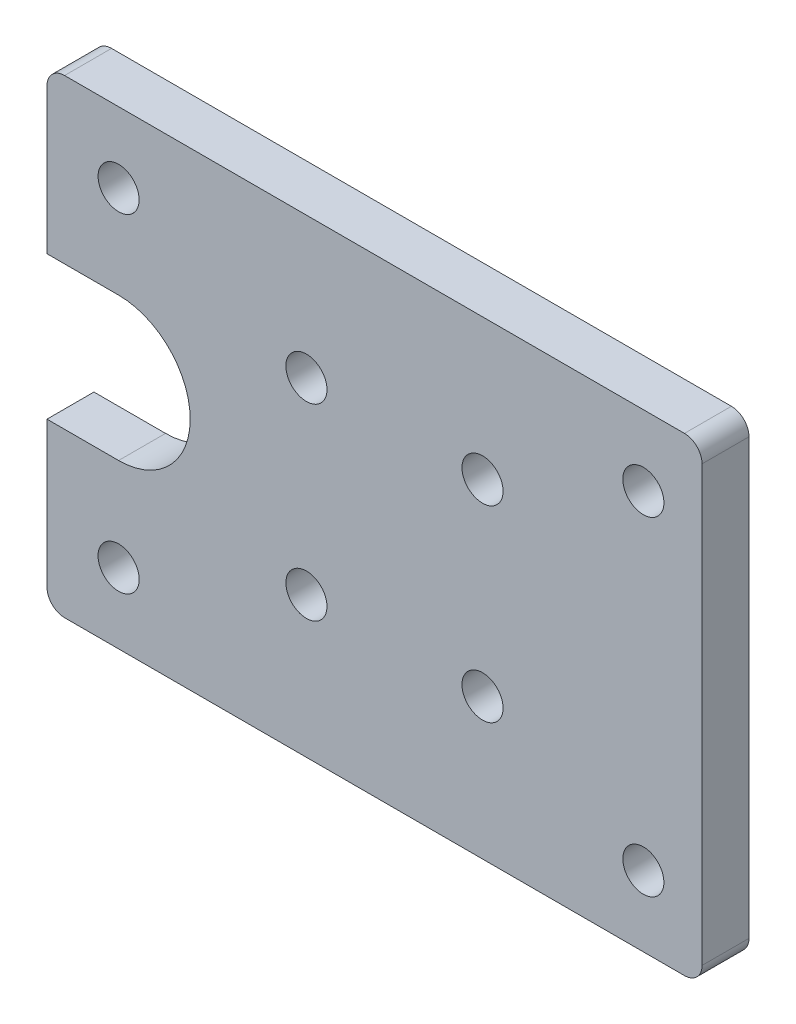
ISO-10303-21;
HEADER;
FILE_DESCRIPTION(('STEP AP214'),'2;1');
FILE_NAME('part.step','',(''),(''),'','','');
FILE_SCHEMA(('AUTOMOTIVE_DESIGN { 1 0 10303 214 1 1 1 1 }'));
ENDSEC;
DATA;
#1=APPLICATION_CONTEXT('core data for automotive mechanical design processes');
#2=APPLICATION_PROTOCOL_DEFINITION('international standard','automotive_design',2000,#1);
#3=PRODUCT_CONTEXT('',#1,'mechanical');
#4=PRODUCT('Part','Part','',(#3));
#5=PRODUCT_RELATED_PRODUCT_CATEGORY('part','',(#4));
#6=PRODUCT_DEFINITION_FORMATION('','',#4);
#7=PRODUCT_DEFINITION_CONTEXT('part definition',#1,'design');
#8=PRODUCT_DEFINITION('design','',#6,#7);
#9=PRODUCT_DEFINITION_SHAPE('','',#8);
#10=(LENGTH_UNIT() NAMED_UNIT(*) SI_UNIT(.MILLI.,.METRE.));
#11=(NAMED_UNIT(*) PLANE_ANGLE_UNIT() SI_UNIT($,.RADIAN.));
#12=(NAMED_UNIT(*) SI_UNIT($,.STERADIAN.) SOLID_ANGLE_UNIT());
#13=UNCERTAINTY_MEASURE_WITH_UNIT(LENGTH_MEASURE(1.E-05),#10,'distance_accuracy_value','');
#14=(GEOMETRIC_REPRESENTATION_CONTEXT(3) GLOBAL_UNCERTAINTY_ASSIGNED_CONTEXT((#13)) GLOBAL_UNIT_ASSIGNED_CONTEXT((#10,
#11,#12)) REPRESENTATION_CONTEXT('',''));
#15=CARTESIAN_POINT('',(0.,0.,0.));
#16=DIRECTION('',(0.,0.,1.));
#17=DIRECTION('',(1.,0.,0.));
#18=AXIS2_PLACEMENT_3D('',#15,#16,#17);
#19=CARTESIAN_POINT('',(31.5,-20.,4.));
#20=DIRECTION('',(0.,1.,0.));
#21=DIRECTION('',(-1.,0.,0.));
#22=AXIS2_PLACEMENT_3D('',#19,#20,#21);
#23=PLANE('',#22);
#24=DIRECTION('',(1.,0.,0.));
#25=VECTOR('',#24,1.);
#26=CARTESIAN_POINT('',(31.5,-20.,0.));
#27=LINE('',#26,#25);
#28=CARTESIAN_POINT('',(-26.3,-20.,0.));
#29=VERTEX_POINT('',#28);
#30=CARTESIAN_POINT('',(26.5,-20.,0.));
#31=VERTEX_POINT('',#30);
#32=EDGE_CURVE('E216',#29,#31,#27,.T.);
#33=ORIENTED_EDGE('',*,*,#32,.T.);
#34=DIRECTION('',(0.,0.,-1.));
#35=VECTOR('',#34,1.);
#36=CARTESIAN_POINT('',(26.5,-20.,4.));
#37=LINE('',#36,#35);
#38=CARTESIAN_POINT('',(26.5,-20.,4.));
#39=VERTEX_POINT('',#38);
#40=EDGE_CURVE('E256',#31,#39,#37,.F.);
#41=ORIENTED_EDGE('',*,*,#40,.T.);
#42=DIRECTION('',(1.,0.,0.));
#43=VECTOR('',#42,1.);
#44=CARTESIAN_POINT('',(31.5,-20.,4.));
#45=LINE('',#44,#43);
#46=CARTESIAN_POINT('',(-26.3,-20.,4.));
#47=VERTEX_POINT('',#46);
#48=EDGE_CURVE('E218',#47,#39,#45,.T.);
#49=ORIENTED_EDGE('',*,*,#48,.F.);
#50=DIRECTION('',(0.,0.,-1.));
#51=VECTOR('',#50,1.);
#52=CARTESIAN_POINT('',(-26.3,-20.,4.));
#53=LINE('',#52,#51);
#54=EDGE_CURVE('E253',#47,#29,#53,.T.);
#55=ORIENTED_EDGE('',*,*,#54,.T.);
#56=EDGE_LOOP('',(#33,#41,#49,#55));
#57=FACE_BOUND('',#56,.T.);
#58=ADVANCED_FACE('F34',(#57),#23,.F.);
#59=CARTESIAN_POINT('',(31.5,20.,4.));
#60=DIRECTION('',(0.,-1.,0.));
#61=DIRECTION('',(1.,0.,0.));
#62=AXIS2_PLACEMENT_3D('',#59,#60,#61);
#63=PLANE('',#62);
#64=DIRECTION('',(-1.,0.,0.));
#65=VECTOR('',#64,1.);
#66=CARTESIAN_POINT('',(31.5,20.,4.));
#67=LINE('',#66,#65);
#68=CARTESIAN_POINT('',(26.5,20.,4.));
#69=VERTEX_POINT('',#68);
#70=CARTESIAN_POINT('',(-26.3,20.,4.));
#71=VERTEX_POINT('',#70);
#72=EDGE_CURVE('E221',#69,#71,#67,.T.);
#73=ORIENTED_EDGE('',*,*,#72,.F.);
#74=DIRECTION('',(0.,0.,-1.));
#75=VECTOR('',#74,1.);
#76=CARTESIAN_POINT('',(26.5,20.,4.));
#77=LINE('',#76,#75);
#78=CARTESIAN_POINT('',(26.5,20.,0.));
#79=VERTEX_POINT('',#78);
#80=EDGE_CURVE('E230',#69,#79,#77,.T.);
#81=ORIENTED_EDGE('',*,*,#80,.T.);
#82=DIRECTION('',(-1.,0.,0.));
#83=VECTOR('',#82,1.);
#84=CARTESIAN_POINT('',(31.5,20.,0.));
#85=LINE('',#84,#83);
#86=CARTESIAN_POINT('',(-26.3,20.,0.));
#87=VERTEX_POINT('',#86);
#88=EDGE_CURVE('E222',#79,#87,#85,.T.);
#89=ORIENTED_EDGE('',*,*,#88,.T.);
#90=DIRECTION('',(0.,0.,-1.));
#91=VECTOR('',#90,1.);
#92=CARTESIAN_POINT('',(-26.3,20.,4.));
#93=LINE('',#92,#91);
#94=EDGE_CURVE('E224',#87,#71,#93,.F.);
#95=ORIENTED_EDGE('',*,*,#94,.T.);
#96=EDGE_LOOP('',(#73,#81,#89,#95));
#97=FACE_BOUND('',#96,.T.);
#98=ADVANCED_FACE('F285',(#97),#63,.F.);
#99=CARTESIAN_POINT('',(-31.5,-18.5,4.));
#100=DIRECTION('',(0.,0.,-1.));
#101=DIRECTION('',(-1.,0.,0.));
#102=AXIS2_PLACEMENT_3D('',#99,#100,#101);
#103=PLANE('',#102);
#104=CARTESIAN_POINT('',(-21.7,-14.,4.));
#105=DIRECTION('',(0.,0.,-1.));
#106=DIRECTION('',(-1.,0.,0.));
#107=AXIS2_PLACEMENT_3D('',#104,#105,#106);
#108=CIRCLE('',#107,1.75);
#109=CARTESIAN_POINT('',(-23.45,-14.,4.));
#110=VERTEX_POINT('',#109);
#111=EDGE_CURVE('E166',#110,#110,#108,.T.);
#112=ORIENTED_EDGE('',*,*,#111,.T.);
#113=EDGE_LOOP('',(#112));
#114=FACE_BOUND('',#113,.T.);
#115=CARTESIAN_POINT('',(-5.70000000000001,-8.,4.));
#116=DIRECTION('',(0.,0.,-1.));
#117=DIRECTION('',(-1.,0.,0.));
#118=AXIS2_PLACEMENT_3D('',#115,#116,#117);
#119=CIRCLE('',#118,1.75);
#120=CARTESIAN_POINT('',(-7.45000000000001,-8.,4.));
#121=VERTEX_POINT('',#120);
#122=EDGE_CURVE('E172',#121,#121,#119,.T.);
#123=ORIENTED_EDGE('',*,*,#122,.T.);
#124=EDGE_LOOP('',(#123));
#125=FACE_BOUND('',#124,.T.);
#126=CARTESIAN_POINT('',(9.29999999999999,-8.,4.));
#127=DIRECTION('',(0.,0.,-1.));
#128=DIRECTION('',(-1.,0.,0.));
#129=AXIS2_PLACEMENT_3D('',#126,#127,#128);
#130=CIRCLE('',#129,1.75);
#131=CARTESIAN_POINT('',(7.54999999999999,-8.,4.));
#132=VERTEX_POINT('',#131);
#133=EDGE_CURVE('E178',#132,#132,#130,.T.);
#134=ORIENTED_EDGE('',*,*,#133,.T.);
#135=EDGE_LOOP('',(#134));
#136=FACE_BOUND('',#135,.T.);
#137=CARTESIAN_POINT('',(23.,-14.,4.));
#138=DIRECTION('',(0.,0.,-1.));
#139=DIRECTION('',(-1.,0.,0.));
#140=AXIS2_PLACEMENT_3D('',#137,#138,#139);
#141=CIRCLE('',#140,1.75);
#142=CARTESIAN_POINT('',(21.25,-14.,4.));
#143=VERTEX_POINT('',#142);
#144=EDGE_CURVE('E184',#143,#143,#141,.T.);
#145=ORIENTED_EDGE('',*,*,#144,.T.);
#146=EDGE_LOOP('',(#145));
#147=FACE_BOUND('',#146,.T.);
#148=CARTESIAN_POINT('',(-21.7,14.,4.));
#149=DIRECTION('',(0.,0.,-1.));
#150=DIRECTION('',(1.,0.,0.));
#151=AXIS2_PLACEMENT_3D('',#148,#149,#150);
#152=CIRCLE('',#151,1.75);
#153=CARTESIAN_POINT('',(-19.95,14.,4.));
#154=VERTEX_POINT('',#153);
#155=EDGE_CURVE('E190',#154,#154,#152,.T.);
#156=ORIENTED_EDGE('',*,*,#155,.T.);
#157=EDGE_LOOP('',(#156));
#158=FACE_BOUND('',#157,.T.);
#159=CARTESIAN_POINT('',(-5.70000000000001,8.,4.));
#160=DIRECTION('',(0.,0.,-1.));
#161=DIRECTION('',(1.,0.,0.));
#162=AXIS2_PLACEMENT_3D('',#159,#160,#161);
#163=CIRCLE('',#162,1.75);
#164=CARTESIAN_POINT('',(-3.95000000000001,8.,4.));
#165=VERTEX_POINT('',#164);
#166=EDGE_CURVE('E196',#165,#165,#163,.T.);
#167=ORIENTED_EDGE('',*,*,#166,.T.);
#168=EDGE_LOOP('',(#167));
#169=FACE_BOUND('',#168,.T.);
#170=CARTESIAN_POINT('',(9.29999999999999,8.00000000000001,4.));
#171=DIRECTION('',(0.,0.,-1.));
#172=DIRECTION('',(1.,0.,0.));
#173=AXIS2_PLACEMENT_3D('',#170,#171,#172);
#174=CIRCLE('',#173,1.75);
#175=CARTESIAN_POINT('',(11.05,8.00000000000001,4.));
#176=VERTEX_POINT('',#175);
#177=EDGE_CURVE('E202',#176,#176,#174,.T.);
#178=ORIENTED_EDGE('',*,*,#177,.T.);
#179=EDGE_LOOP('',(#178));
#180=FACE_BOUND('',#179,.T.);
#181=CARTESIAN_POINT('',(23.,14.,4.));
#182=DIRECTION('',(0.,0.,-1.));
#183=DIRECTION('',(1.,0.,0.));
#184=AXIS2_PLACEMENT_3D('',#181,#182,#183);
#185=CIRCLE('',#184,1.75);
#186=CARTESIAN_POINT('',(24.75,14.,4.));
#187=VERTEX_POINT('',#186);
#188=EDGE_CURVE('E208',#187,#187,#185,.T.);
#189=ORIENTED_EDGE('',*,*,#188,.T.);
#190=EDGE_LOOP('',(#189));
#191=FACE_BOUND('',#190,.T.);
#192=DIRECTION('',(0.,-1.,0.));
#193=VECTOR('',#192,1.);
#194=CARTESIAN_POINT('',(28.,20.,4.));
#195=LINE('',#194,#193);
#196=CARTESIAN_POINT('',(28.,18.5,4.));
#197=VERTEX_POINT('',#196);
#198=CARTESIAN_POINT('',(28.,-18.5,4.));
#199=VERTEX_POINT('',#198);
#200=EDGE_CURVE('E133',#197,#199,#195,.T.);
#201=ORIENTED_EDGE('',*,*,#200,.F.);
#202=CARTESIAN_POINT('',(26.5,18.5,4.));
#203=DIRECTION('',(0.,0.,-1.));
#204=DIRECTION('',(-1.,0.,0.));
#205=AXIS2_PLACEMENT_3D('',#202,#203,#204);
#206=CIRCLE('',#205,1.5);
#207=EDGE_CURVE('E251',#197,#69,#206,.F.);
#208=ORIENTED_EDGE('',*,*,#207,.T.);
#209=ORIENTED_EDGE('',*,*,#72,.T.);
#210=CARTESIAN_POINT('',(-26.3,18.5,4.));
#211=DIRECTION('',(0.,0.,-1.));
#212=DIRECTION('',(-1.,0.,0.));
#213=AXIS2_PLACEMENT_3D('',#210,#211,#212);
#214=CIRCLE('',#213,1.5);
#215=CARTESIAN_POINT('',(-27.8,18.5,4.));
#216=VERTEX_POINT('',#215);
#217=EDGE_CURVE('E56',#71,#216,#214,.F.);
#218=ORIENTED_EDGE('',*,*,#217,.T.);
#219=DIRECTION('',(0.,1.,0.));
#220=VECTOR('',#219,1.);
#221=CARTESIAN_POINT('',(-27.8,20.,4.));
#222=LINE('',#221,#220);
#223=CARTESIAN_POINT('',(-27.8,6.1,4.));
#224=VERTEX_POINT('',#223);
#225=EDGE_CURVE('E165',#224,#216,#222,.T.);
#226=ORIENTED_EDGE('',*,*,#225,.F.);
#227=DIRECTION('',(-1.,0.,0.));
#228=VECTOR('',#227,1.);
#229=CARTESIAN_POINT('',(-21.7,6.1,4.));
#230=LINE('',#229,#228);
#231=CARTESIAN_POINT('',(-21.7,6.1,4.00000000000002));
#232=VERTEX_POINT('',#231);
#233=EDGE_CURVE('E139',#232,#224,#230,.T.);
#234=ORIENTED_EDGE('',*,*,#233,.F.);
#235=CARTESIAN_POINT('',(-21.7,0.,4.));
#236=DIRECTION('',(0.,0.,-1.));
#237=DIRECTION('',(-1.,0.,0.));
#238=AXIS2_PLACEMENT_3D('',#235,#236,#237);
#239=CIRCLE('',#238,6.1);
#240=CARTESIAN_POINT('',(-21.7,-6.1,4.));
#241=VERTEX_POINT('',#240);
#242=EDGE_CURVE('E213',#232,#241,#239,.T.);
#243=ORIENTED_EDGE('',*,*,#242,.T.);
#244=DIRECTION('',(1.,0.,0.));
#245=VECTOR('',#244,1.);
#246=CARTESIAN_POINT('',(-21.7,-6.1,4.));
#247=LINE('',#246,#245);
#248=CARTESIAN_POINT('',(-27.8,-6.1,4.));
#249=VERTEX_POINT('',#248);
#250=EDGE_CURVE('E159',#249,#241,#247,.T.);
#251=ORIENTED_EDGE('',*,*,#250,.F.);
#252=DIRECTION('',(0.,1.,0.));
#253=VECTOR('',#252,1.);
#254=CARTESIAN_POINT('',(-27.8,-6.1,4.));
#255=LINE('',#254,#253);
#256=CARTESIAN_POINT('',(-27.8,-18.5,4.));
#257=VERTEX_POINT('',#256);
#258=EDGE_CURVE('E280',#257,#249,#255,.T.);
#259=ORIENTED_EDGE('',*,*,#258,.F.);
#260=CARTESIAN_POINT('',(-26.3,-18.5,4.));
#261=DIRECTION('',(0.,0.,-1.));
#262=DIRECTION('',(-1.,0.,0.));
#263=AXIS2_PLACEMENT_3D('',#260,#261,#262);
#264=CIRCLE('',#263,1.5);
#265=EDGE_CURVE('E247',#257,#47,#264,.F.);
#266=ORIENTED_EDGE('',*,*,#265,.T.);
#267=ORIENTED_EDGE('',*,*,#48,.T.);
#268=CARTESIAN_POINT('',(26.5,-18.5,4.));
#269=DIRECTION('',(0.,0.,-1.));
#270=DIRECTION('',(-1.,0.,0.));
#271=AXIS2_PLACEMENT_3D('',#268,#269,#270);
#272=CIRCLE('',#271,1.5);
#273=EDGE_CURVE('E249',#39,#199,#272,.F.);
#274=ORIENTED_EDGE('',*,*,#273,.T.);
#275=EDGE_LOOP('',(#201,#208,#209,#218,#226,#234,#243,#251,#259,#266,#267,#274));
#276=FACE_BOUND('',#275,.T.);
#277=ADVANCED_FACE('F265',(#114,#125,#136,#147,#158,#169,#180,#191,#276),#103,.F.);
#278=CARTESIAN_POINT('',(-31.5,-18.5,0.));
#279=DIRECTION('',(0.,0.,-1.));
#280=DIRECTION('',(-1.,0.,0.));
#281=AXIS2_PLACEMENT_3D('',#278,#279,#280);
#282=PLANE('',#281);
#283=ORIENTED_EDGE('',*,*,#88,.F.);
#284=CARTESIAN_POINT('',(26.5,18.5,0.));
#285=DIRECTION('',(0.,0.,-1.));
#286=DIRECTION('',(-1.,0.,0.));
#287=AXIS2_PLACEMENT_3D('',#284,#285,#286);
#288=CIRCLE('',#287,1.5);
#289=CARTESIAN_POINT('',(28.,18.5,0.));
#290=VERTEX_POINT('',#289);
#291=EDGE_CURVE('E239',#79,#290,#288,.T.);
#292=ORIENTED_EDGE('',*,*,#291,.T.);
#293=DIRECTION('',(0.,1.,0.));
#294=VECTOR('',#293,1.);
#295=CARTESIAN_POINT('',(28.,20.,0.));
#296=LINE('',#295,#294);
#297=CARTESIAN_POINT('',(28.,-18.5,0.));
#298=VERTEX_POINT('',#297);
#299=EDGE_CURVE('E274',#298,#290,#296,.T.);
#300=ORIENTED_EDGE('',*,*,#299,.F.);
#301=CARTESIAN_POINT('',(26.5,-18.5,0.));
#302=DIRECTION('',(0.,0.,-1.));
#303=DIRECTION('',(-1.,0.,0.));
#304=AXIS2_PLACEMENT_3D('',#301,#302,#303);
#305=CIRCLE('',#304,1.5);
#306=EDGE_CURVE('E237',#298,#31,#305,.T.);
#307=ORIENTED_EDGE('',*,*,#306,.T.);
#308=ORIENTED_EDGE('',*,*,#32,.F.);
#309=CARTESIAN_POINT('',(-26.3,-18.5,0.));
#310=DIRECTION('',(0.,0.,-1.));
#311=DIRECTION('',(-1.,0.,0.));
#312=AXIS2_PLACEMENT_3D('',#309,#310,#311);
#313=CIRCLE('',#312,1.5);
#314=CARTESIAN_POINT('',(-27.8,-18.5,0.));
#315=VERTEX_POINT('',#314);
#316=EDGE_CURVE('E235',#29,#315,#313,.T.);
#317=ORIENTED_EDGE('',*,*,#316,.T.);
#318=DIRECTION('',(0.,-1.,0.));
#319=VECTOR('',#318,1.);
#320=CARTESIAN_POINT('',(-27.8,-6.1,0.));
#321=LINE('',#320,#319);
#322=CARTESIAN_POINT('',(-27.8,-6.1,0.));
#323=VERTEX_POINT('',#322);
#324=EDGE_CURVE('E141',#323,#315,#321,.T.);
#325=ORIENTED_EDGE('',*,*,#324,.F.);
#326=DIRECTION('',(-1.,0.,0.));
#327=VECTOR('',#326,1.);
#328=CARTESIAN_POINT('',(-21.7,-6.1,0.));
#329=LINE('',#328,#327);
#330=CARTESIAN_POINT('',(-21.7,-6.1,0.));
#331=VERTEX_POINT('',#330);
#332=EDGE_CURVE('E150',#331,#323,#329,.T.);
#333=ORIENTED_EDGE('',*,*,#332,.F.);
#334=CARTESIAN_POINT('',(-21.7,0.,0.));
#335=DIRECTION('',(0.,0.,-1.));
#336=DIRECTION('',(-1.,0.,0.));
#337=AXIS2_PLACEMENT_3D('',#334,#335,#336);
#338=CIRCLE('',#337,6.1);
#339=CARTESIAN_POINT('',(-21.7,6.1,0.));
#340=VERTEX_POINT('',#339);
#341=EDGE_CURVE('E149',#340,#331,#338,.T.);
#342=ORIENTED_EDGE('',*,*,#341,.F.);
#343=DIRECTION('',(1.,0.,0.));
#344=VECTOR('',#343,1.);
#345=CARTESIAN_POINT('',(-21.7,6.1,0.));
#346=LINE('',#345,#344);
#347=CARTESIAN_POINT('',(-27.8,6.1,0.));
#348=VERTEX_POINT('',#347);
#349=EDGE_CURVE('E132',#348,#340,#346,.T.);
#350=ORIENTED_EDGE('',*,*,#349,.F.);
#351=DIRECTION('',(0.,-1.,0.));
#352=VECTOR('',#351,1.);
#353=CARTESIAN_POINT('',(-27.8,20.,0.));
#354=LINE('',#353,#352);
#355=CARTESIAN_POINT('',(-27.8,18.5,0.));
#356=VERTEX_POINT('',#355);
#357=EDGE_CURVE('E125',#356,#348,#354,.T.);
#358=ORIENTED_EDGE('',*,*,#357,.F.);
#359=CARTESIAN_POINT('',(-26.3,18.5,0.));
#360=DIRECTION('',(0.,0.,-1.));
#361=DIRECTION('',(-1.,0.,0.));
#362=AXIS2_PLACEMENT_3D('',#359,#360,#361);
#363=CIRCLE('',#362,1.5);
#364=EDGE_CURVE('E233',#356,#87,#363,.T.);
#365=ORIENTED_EDGE('',*,*,#364,.T.);
#366=EDGE_LOOP('',(#283,#292,#300,#307,#308,#317,#325,#333,#342,#350,#358,#365));
#367=FACE_BOUND('',#366,.T.);
#368=CARTESIAN_POINT('',(-21.7,-14.,0.));
#369=DIRECTION('',(0.,0.,-1.));
#370=DIRECTION('',(-1.,0.,0.));
#371=AXIS2_PLACEMENT_3D('',#368,#369,#370);
#372=CIRCLE('',#371,1.75);
#373=CARTESIAN_POINT('',(-23.45,-14.,0.));
#374=VERTEX_POINT('',#373);
#375=EDGE_CURVE('E169',#374,#374,#372,.T.);
#376=ORIENTED_EDGE('',*,*,#375,.F.);
#377=EDGE_LOOP('',(#376));
#378=FACE_BOUND('',#377,.T.);
#379=CARTESIAN_POINT('',(-5.70000000000001,-8.,0.));
#380=DIRECTION('',(0.,0.,-1.));
#381=DIRECTION('',(-1.,0.,0.));
#382=AXIS2_PLACEMENT_3D('',#379,#380,#381);
#383=CIRCLE('',#382,1.75);
#384=CARTESIAN_POINT('',(-7.45000000000001,-8.,0.));
#385=VERTEX_POINT('',#384);
#386=EDGE_CURVE('E175',#385,#385,#383,.T.);
#387=ORIENTED_EDGE('',*,*,#386,.F.);
#388=EDGE_LOOP('',(#387));
#389=FACE_BOUND('',#388,.T.);
#390=CARTESIAN_POINT('',(9.29999999999999,-8.,0.));
#391=DIRECTION('',(0.,0.,-1.));
#392=DIRECTION('',(-1.,0.,0.));
#393=AXIS2_PLACEMENT_3D('',#390,#391,#392);
#394=CIRCLE('',#393,1.75);
#395=CARTESIAN_POINT('',(7.54999999999999,-8.,0.));
#396=VERTEX_POINT('',#395);
#397=EDGE_CURVE('E181',#396,#396,#394,.T.);
#398=ORIENTED_EDGE('',*,*,#397,.F.);
#399=EDGE_LOOP('',(#398));
#400=FACE_BOUND('',#399,.T.);
#401=CARTESIAN_POINT('',(23.,-14.,0.));
#402=DIRECTION('',(0.,0.,-1.));
#403=DIRECTION('',(-1.,0.,0.));
#404=AXIS2_PLACEMENT_3D('',#401,#402,#403);
#405=CIRCLE('',#404,1.75);
#406=CARTESIAN_POINT('',(21.25,-14.,0.));
#407=VERTEX_POINT('',#406);
#408=EDGE_CURVE('E187',#407,#407,#405,.T.);
#409=ORIENTED_EDGE('',*,*,#408,.F.);
#410=EDGE_LOOP('',(#409));
#411=FACE_BOUND('',#410,.T.);
#412=CARTESIAN_POINT('',(-21.7,14.,0.));
#413=DIRECTION('',(0.,0.,-1.));
#414=DIRECTION('',(1.,0.,0.));
#415=AXIS2_PLACEMENT_3D('',#412,#413,#414);
#416=CIRCLE('',#415,1.75);
#417=CARTESIAN_POINT('',(-19.95,14.,0.));
#418=VERTEX_POINT('',#417);
#419=EDGE_CURVE('E193',#418,#418,#416,.T.);
#420=ORIENTED_EDGE('',*,*,#419,.F.);
#421=EDGE_LOOP('',(#420));
#422=FACE_BOUND('',#421,.T.);
#423=CARTESIAN_POINT('',(-5.70000000000001,8.,0.));
#424=DIRECTION('',(0.,0.,-1.));
#425=DIRECTION('',(1.,0.,0.));
#426=AXIS2_PLACEMENT_3D('',#423,#424,#425);
#427=CIRCLE('',#426,1.75);
#428=CARTESIAN_POINT('',(-3.95000000000001,8.,0.));
#429=VERTEX_POINT('',#428);
#430=EDGE_CURVE('E199',#429,#429,#427,.T.);
#431=ORIENTED_EDGE('',*,*,#430,.F.);
#432=EDGE_LOOP('',(#431));
#433=FACE_BOUND('',#432,.T.);
#434=CARTESIAN_POINT('',(9.29999999999999,8.00000000000001,0.));
#435=DIRECTION('',(0.,0.,-1.));
#436=DIRECTION('',(1.,0.,0.));
#437=AXIS2_PLACEMENT_3D('',#434,#435,#436);
#438=CIRCLE('',#437,1.75);
#439=CARTESIAN_POINT('',(11.05,8.00000000000001,0.));
#440=VERTEX_POINT('',#439);
#441=EDGE_CURVE('E205',#440,#440,#438,.T.);
#442=ORIENTED_EDGE('',*,*,#441,.F.);
#443=EDGE_LOOP('',(#442));
#444=FACE_BOUND('',#443,.T.);
#445=CARTESIAN_POINT('',(23.,14.,0.));
#446=DIRECTION('',(0.,0.,-1.));
#447=DIRECTION('',(1.,0.,0.));
#448=AXIS2_PLACEMENT_3D('',#445,#446,#447);
#449=CIRCLE('',#448,1.75);
#450=CARTESIAN_POINT('',(24.75,14.,0.));
#451=VERTEX_POINT('',#450);
#452=EDGE_CURVE('E164',#451,#451,#449,.T.);
#453=ORIENTED_EDGE('',*,*,#452,.F.);
#454=EDGE_LOOP('',(#453));
#455=FACE_BOUND('',#454,.T.);
#456=ADVANCED_FACE('F145',(#367,#378,#389,#400,#411,#422,#433,#444,#455),#282,.T.);
#457=CARTESIAN_POINT('',(-21.7,0.,4.));
#458=DIRECTION('',(0.,0.,-1.));
#459=DIRECTION('',(-1.,0.,0.));
#460=AXIS2_PLACEMENT_3D('',#457,#458,#459);
#461=CYLINDRICAL_SURFACE('',#460,6.1);
#462=ORIENTED_EDGE('',*,*,#341,.T.);
#463=DIRECTION('',(0.,0.,-1.));
#464=VECTOR('',#463,1.);
#465=CARTESIAN_POINT('',(-21.7,-6.1,45.5654904939181));
#466=LINE('',#465,#464);
#467=EDGE_CURVE('E160',#241,#331,#466,.T.);
#468=ORIENTED_EDGE('',*,*,#467,.F.);
#469=ORIENTED_EDGE('',*,*,#242,.F.);
#470=DIRECTION('',(0.,0.,-1.));
#471=VECTOR('',#470,1.);
#472=CARTESIAN_POINT('',(-21.7,6.1,45.5654904939181));
#473=LINE('',#472,#471);
#474=EDGE_CURVE('E140',#232,#340,#473,.T.);
#475=ORIENTED_EDGE('',*,*,#474,.T.);
#476=EDGE_LOOP('',(#462,#468,#469,#475));
#477=FACE_BOUND('',#476,.T.);
#478=ADVANCED_FACE('F309',(#477),#461,.F.);
#479=CARTESIAN_POINT('',(23.,14.,4.));
#480=DIRECTION('',(0.,0.,-1.));
#481=DIRECTION('',(-1.,0.,0.));
#482=AXIS2_PLACEMENT_3D('',#479,#480,#481);
#483=CYLINDRICAL_SURFACE('',#482,1.75);
#484=ORIENTED_EDGE('',*,*,#188,.F.);
#485=EDGE_LOOP('',(#484));
#486=FACE_BOUND('',#485,.T.);
#487=ORIENTED_EDGE('',*,*,#452,.T.);
#488=EDGE_LOOP('',(#487));
#489=FACE_BOUND('',#488,.T.);
#490=ADVANCED_FACE('F315',(#486,#489),#483,.F.);
#491=CARTESIAN_POINT('',(9.29999999999999,8.00000000000001,4.));
#492=DIRECTION('',(0.,0.,-1.));
#493=DIRECTION('',(-1.,0.,0.));
#494=AXIS2_PLACEMENT_3D('',#491,#492,#493);
#495=CYLINDRICAL_SURFACE('',#494,1.75);
#496=ORIENTED_EDGE('',*,*,#177,.F.);
#497=EDGE_LOOP('',(#496));
#498=FACE_BOUND('',#497,.T.);
#499=ORIENTED_EDGE('',*,*,#441,.T.);
#500=EDGE_LOOP('',(#499));
#501=FACE_BOUND('',#500,.T.);
#502=ADVANCED_FACE('F319',(#498,#501),#495,.F.);
#503=CARTESIAN_POINT('',(-5.70000000000001,8.,4.));
#504=DIRECTION('',(0.,0.,-1.));
#505=DIRECTION('',(-1.,0.,0.));
#506=AXIS2_PLACEMENT_3D('',#503,#504,#505);
#507=CYLINDRICAL_SURFACE('',#506,1.75);
#508=ORIENTED_EDGE('',*,*,#166,.F.);
#509=EDGE_LOOP('',(#508));
#510=FACE_BOUND('',#509,.T.);
#511=ORIENTED_EDGE('',*,*,#430,.T.);
#512=EDGE_LOOP('',(#511));
#513=FACE_BOUND('',#512,.T.);
#514=ADVANCED_FACE('F323',(#510,#513),#507,.F.);
#515=CARTESIAN_POINT('',(-21.7,14.,4.));
#516=DIRECTION('',(0.,0.,-1.));
#517=DIRECTION('',(-1.,0.,0.));
#518=AXIS2_PLACEMENT_3D('',#515,#516,#517);
#519=CYLINDRICAL_SURFACE('',#518,1.75);
#520=ORIENTED_EDGE('',*,*,#155,.F.);
#521=EDGE_LOOP('',(#520));
#522=FACE_BOUND('',#521,.T.);
#523=ORIENTED_EDGE('',*,*,#419,.T.);
#524=EDGE_LOOP('',(#523));
#525=FACE_BOUND('',#524,.T.);
#526=ADVANCED_FACE('F327',(#522,#525),#519,.F.);
#527=CARTESIAN_POINT('',(23.,-14.,4.));
#528=DIRECTION('',(0.,0.,-1.));
#529=DIRECTION('',(-1.,0.,0.));
#530=AXIS2_PLACEMENT_3D('',#527,#528,#529);
#531=CYLINDRICAL_SURFACE('',#530,1.75);
#532=ORIENTED_EDGE('',*,*,#144,.F.);
#533=EDGE_LOOP('',(#532));
#534=FACE_BOUND('',#533,.T.);
#535=ORIENTED_EDGE('',*,*,#408,.T.);
#536=EDGE_LOOP('',(#535));
#537=FACE_BOUND('',#536,.T.);
#538=ADVANCED_FACE('F331',(#534,#537),#531,.F.);
#539=CARTESIAN_POINT('',(9.29999999999999,-8.,4.));
#540=DIRECTION('',(0.,0.,-1.));
#541=DIRECTION('',(-1.,0.,0.));
#542=AXIS2_PLACEMENT_3D('',#539,#540,#541);
#543=CYLINDRICAL_SURFACE('',#542,1.75);
#544=ORIENTED_EDGE('',*,*,#133,.F.);
#545=EDGE_LOOP('',(#544));
#546=FACE_BOUND('',#545,.T.);
#547=ORIENTED_EDGE('',*,*,#397,.T.);
#548=EDGE_LOOP('',(#547));
#549=FACE_BOUND('',#548,.T.);
#550=ADVANCED_FACE('F335',(#546,#549),#543,.F.);
#551=CARTESIAN_POINT('',(-5.70000000000001,-8.,4.));
#552=DIRECTION('',(0.,0.,-1.));
#553=DIRECTION('',(-1.,0.,0.));
#554=AXIS2_PLACEMENT_3D('',#551,#552,#553);
#555=CYLINDRICAL_SURFACE('',#554,1.75);
#556=ORIENTED_EDGE('',*,*,#122,.F.);
#557=EDGE_LOOP('',(#556));
#558=FACE_BOUND('',#557,.T.);
#559=ORIENTED_EDGE('',*,*,#386,.T.);
#560=EDGE_LOOP('',(#559));
#561=FACE_BOUND('',#560,.T.);
#562=ADVANCED_FACE('F339',(#558,#561),#555,.F.);
#563=CARTESIAN_POINT('',(-21.7,-14.,4.));
#564=DIRECTION('',(0.,0.,-1.));
#565=DIRECTION('',(-1.,0.,0.));
#566=AXIS2_PLACEMENT_3D('',#563,#564,#565);
#567=CYLINDRICAL_SURFACE('',#566,1.75);
#568=ORIENTED_EDGE('',*,*,#111,.F.);
#569=EDGE_LOOP('',(#568));
#570=FACE_BOUND('',#569,.T.);
#571=ORIENTED_EDGE('',*,*,#375,.T.);
#572=EDGE_LOOP('',(#571));
#573=FACE_BOUND('',#572,.T.);
#574=ADVANCED_FACE('F343',(#570,#573),#567,.F.);
#575=CARTESIAN_POINT('',(-21.7,6.1,45.5654904939181));
#576=DIRECTION('',(0.,1.,0.));
#577=DIRECTION('',(0.,0.,1.));
#578=AXIS2_PLACEMENT_3D('',#575,#576,#577);
#579=PLANE('',#578);
#580=ORIENTED_EDGE('',*,*,#233,.T.);
#581=DIRECTION('',(0.,0.,-1.));
#582=VECTOR('',#581,1.);
#583=CARTESIAN_POINT('',(-27.8,6.1,45.5654904939181));
#584=LINE('',#583,#582);
#585=EDGE_CURVE('E128',#224,#348,#584,.T.);
#586=ORIENTED_EDGE('',*,*,#585,.T.);
#587=ORIENTED_EDGE('',*,*,#349,.T.);
#588=ORIENTED_EDGE('',*,*,#474,.F.);
#589=EDGE_LOOP('',(#580,#586,#587,#588));
#590=FACE_BOUND('',#589,.T.);
#591=ADVANCED_FACE('F136',(#590),#579,.F.);
#592=CARTESIAN_POINT('',(-27.8,20.,45.5654904939181));
#593=DIRECTION('',(1.,0.,0.));
#594=DIRECTION('',(0.,0.,-1.));
#595=AXIS2_PLACEMENT_3D('',#592,#593,#594);
#596=PLANE('',#595);
#597=ORIENTED_EDGE('',*,*,#225,.T.);
#598=DIRECTION('',(0.,0.,-1.));
#599=VECTOR('',#598,1.);
#600=CARTESIAN_POINT('',(-27.8,18.5,45.5654904939181));
#601=LINE('',#600,#599);
#602=EDGE_CURVE('E11',#216,#356,#601,.T.);
#603=ORIENTED_EDGE('',*,*,#602,.T.);
#604=ORIENTED_EDGE('',*,*,#357,.T.);
#605=ORIENTED_EDGE('',*,*,#585,.F.);
#606=EDGE_LOOP('',(#597,#603,#604,#605));
#607=FACE_BOUND('',#606,.T.);
#608=ADVANCED_FACE('F127',(#607),#596,.F.);
#609=CARTESIAN_POINT('',(-27.8,-6.1,45.5654904939181));
#610=DIRECTION('',(1.,0.,0.));
#611=DIRECTION('',(0.,0.,-1.));
#612=AXIS2_PLACEMENT_3D('',#609,#610,#611);
#613=PLANE('',#612);
#614=ORIENTED_EDGE('',*,*,#324,.T.);
#615=DIRECTION('',(0.,0.,-1.));
#616=VECTOR('',#615,1.);
#617=CARTESIAN_POINT('',(-27.8,-18.5,45.5654904939181));
#618=LINE('',#617,#616);
#619=EDGE_CURVE('E42',#315,#257,#618,.F.);
#620=ORIENTED_EDGE('',*,*,#619,.T.);
#621=ORIENTED_EDGE('',*,*,#258,.T.);
#622=DIRECTION('',(0.,0.,-1.));
#623=VECTOR('',#622,1.);
#624=CARTESIAN_POINT('',(-27.8,-6.1,45.5654904939181));
#625=LINE('',#624,#623);
#626=EDGE_CURVE('E157',#249,#323,#625,.T.);
#627=ORIENTED_EDGE('',*,*,#626,.T.);
#628=EDGE_LOOP('',(#614,#620,#621,#627));
#629=FACE_BOUND('',#628,.T.);
#630=ADVANCED_FACE('F350',(#629),#613,.F.);
#631=CARTESIAN_POINT('',(-21.7,-6.1,45.5654904939181));
#632=DIRECTION('',(0.,-1.,0.));
#633=DIRECTION('',(0.,0.,-1.));
#634=AXIS2_PLACEMENT_3D('',#631,#632,#633);
#635=PLANE('',#634);
#636=ORIENTED_EDGE('',*,*,#250,.T.);
#637=ORIENTED_EDGE('',*,*,#467,.T.);
#638=ORIENTED_EDGE('',*,*,#332,.T.);
#639=ORIENTED_EDGE('',*,*,#626,.F.);
#640=EDGE_LOOP('',(#636,#637,#638,#639));
#641=FACE_BOUND('',#640,.T.);
#642=ADVANCED_FACE('F298',(#641),#635,.F.);
#643=CARTESIAN_POINT('',(28.,20.,45.5654904939181));
#644=DIRECTION('',(-1.,0.,0.));
#645=DIRECTION('',(0.,-1.,0.));
#646=AXIS2_PLACEMENT_3D('',#643,#644,#645);
#647=PLANE('',#646);
#648=ORIENTED_EDGE('',*,*,#299,.T.);
#649=DIRECTION('',(0.,0.,-1.));
#650=VECTOR('',#649,1.);
#651=CARTESIAN_POINT('',(28.,18.5,45.5654904939181));
#652=LINE('',#651,#650);
#653=EDGE_CURVE('E244',#290,#197,#652,.F.);
#654=ORIENTED_EDGE('',*,*,#653,.T.);
#655=ORIENTED_EDGE('',*,*,#200,.T.);
#656=DIRECTION('',(0.,0.,-1.));
#657=VECTOR('',#656,1.);
#658=CARTESIAN_POINT('',(28.,-18.5,45.5654904939181));
#659=LINE('',#658,#657);
#660=EDGE_CURVE('E241',#199,#298,#659,.T.);
#661=ORIENTED_EDGE('',*,*,#660,.T.);
#662=EDGE_LOOP('',(#648,#654,#655,#661));
#663=FACE_BOUND('',#662,.T.);
#664=ADVANCED_FACE('F273',(#663),#647,.F.);
#665=CARTESIAN_POINT('',(26.5,18.5,4.));
#666=DIRECTION('',(0.,0.,-1.));
#667=DIRECTION('',(-1.,0.,0.));
#668=AXIS2_PLACEMENT_3D('',#665,#666,#667);
#669=CYLINDRICAL_SURFACE('',#668,1.5);
#670=ORIENTED_EDGE('',*,*,#207,.F.);
#671=ORIENTED_EDGE('',*,*,#653,.F.);
#672=ORIENTED_EDGE('',*,*,#291,.F.);
#673=ORIENTED_EDGE('',*,*,#80,.F.);
#674=EDGE_LOOP('',(#670,#671,#672,#673));
#675=FACE_BOUND('',#674,.T.);
#676=ADVANCED_FACE('F289',(#675),#669,.T.);
#677=CARTESIAN_POINT('',(26.5,-18.5,45.5654904939181));
#678=DIRECTION('',(0.,0.,-1.));
#679=DIRECTION('',(-1.,0.,0.));
#680=AXIS2_PLACEMENT_3D('',#677,#678,#679);
#681=CYLINDRICAL_SURFACE('',#680,1.5);
#682=ORIENTED_EDGE('',*,*,#273,.F.);
#683=ORIENTED_EDGE('',*,*,#40,.F.);
#684=ORIENTED_EDGE('',*,*,#306,.F.);
#685=ORIENTED_EDGE('',*,*,#660,.F.);
#686=EDGE_LOOP('',(#682,#683,#684,#685));
#687=FACE_BOUND('',#686,.T.);
#688=ADVANCED_FACE('F269',(#687),#681,.T.);
#689=CARTESIAN_POINT('',(-26.3,-18.5,4.));
#690=DIRECTION('',(0.,0.,-1.));
#691=DIRECTION('',(-1.,0.,0.));
#692=AXIS2_PLACEMENT_3D('',#689,#690,#691);
#693=CYLINDRICAL_SURFACE('',#692,1.5);
#694=ORIENTED_EDGE('',*,*,#265,.F.);
#695=ORIENTED_EDGE('',*,*,#619,.F.);
#696=ORIENTED_EDGE('',*,*,#316,.F.);
#697=ORIENTED_EDGE('',*,*,#54,.F.);
#698=EDGE_LOOP('',(#694,#695,#696,#697));
#699=FACE_BOUND('',#698,.T.);
#700=ADVANCED_FACE('F296',(#699),#693,.T.);
#701=CARTESIAN_POINT('',(-26.3,18.5,45.5654904939181));
#702=DIRECTION('',(0.,0.,-1.));
#703=DIRECTION('',(-1.,0.,0.));
#704=AXIS2_PLACEMENT_3D('',#701,#702,#703);
#705=CYLINDRICAL_SURFACE('',#704,1.5);
#706=ORIENTED_EDGE('',*,*,#217,.F.);
#707=ORIENTED_EDGE('',*,*,#94,.F.);
#708=ORIENTED_EDGE('',*,*,#364,.F.);
#709=ORIENTED_EDGE('',*,*,#602,.F.);
#710=EDGE_LOOP('',(#706,#707,#708,#709));
#711=FACE_BOUND('',#710,.T.);
#712=ADVANCED_FACE('F36',(#711),#705,.T.);
#713=CLOSED_SHELL('',(#58,#98,#277,#456,#478,#490,#502,#514,#526,#538,#550,#562,#574,#591,#608,
#630,#642,#664,#676,#688,#700,#712));
#714=MANIFOLD_SOLID_BREP('B2',#713);
#715=ADVANCED_BREP_SHAPE_REPRESENTATION('',(#18,#714),#14);
#716=SHAPE_DEFINITION_REPRESENTATION(#9,#715);
ENDSEC;
END-ISO-10303-21;
